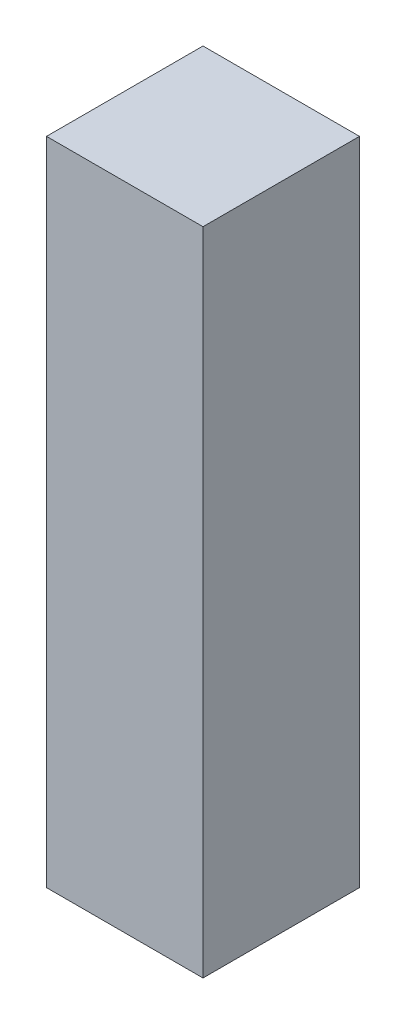
ISO-10303-21;
HEADER;
FILE_DESCRIPTION(('STEP AP214'),'2;1');
FILE_NAME('part.step','',(''),(''),'','','');
FILE_SCHEMA(('AUTOMOTIVE_DESIGN { 1 0 10303 214 1 1 1 1 }'));
ENDSEC;
DATA;
#1=APPLICATION_CONTEXT('core data for automotive mechanical design processes');
#2=APPLICATION_PROTOCOL_DEFINITION('international standard','automotive_design',2000,#1);
#3=PRODUCT_CONTEXT('',#1,'mechanical');
#4=PRODUCT('Part','Part','',(#3));
#5=PRODUCT_RELATED_PRODUCT_CATEGORY('part','',(#4));
#6=PRODUCT_DEFINITION_FORMATION('','',#4);
#7=PRODUCT_DEFINITION_CONTEXT('part definition',#1,'design');
#8=PRODUCT_DEFINITION('design','',#6,#7);
#9=PRODUCT_DEFINITION_SHAPE('','',#8);
#10=(LENGTH_UNIT() NAMED_UNIT(*) SI_UNIT(.MILLI.,.METRE.));
#11=(NAMED_UNIT(*) PLANE_ANGLE_UNIT() SI_UNIT($,.RADIAN.));
#12=(NAMED_UNIT(*) SI_UNIT($,.STERADIAN.) SOLID_ANGLE_UNIT());
#13=UNCERTAINTY_MEASURE_WITH_UNIT(LENGTH_MEASURE(1.E-05),#10,'distance_accuracy_value','');
#14=(GEOMETRIC_REPRESENTATION_CONTEXT(3) GLOBAL_UNCERTAINTY_ASSIGNED_CONTEXT((#13)) GLOBAL_UNIT_ASSIGNED_CONTEXT((#10,
#11,#12)) REPRESENTATION_CONTEXT('',''));
#15=CARTESIAN_POINT('',(0.,0.,0.));
#16=DIRECTION('',(0.,0.,1.));
#17=DIRECTION('',(1.,0.,0.));
#18=AXIS2_PLACEMENT_3D('',#15,#16,#17);
#19=CARTESIAN_POINT('',(0.,158.,0.));
#20=DIRECTION('',(1.,0.,0.));
#21=DIRECTION('',(0.,0.,-1.));
#22=AXIS2_PLACEMENT_3D('',#19,#20,#21);
#23=PLANE('',#22);
#24=DIRECTION('',(0.,0.,1.));
#25=VECTOR('',#24,1.);
#26=CARTESIAN_POINT('',(0.,0.,0.));
#27=LINE('',#26,#25);
#28=CARTESIAN_POINT('',(0.,0.,-38.));
#29=VERTEX_POINT('',#28);
#30=CARTESIAN_POINT('',(0.,0.,0.));
#31=VERTEX_POINT('',#30);
#32=EDGE_CURVE('E101',#29,#31,#27,.T.);
#33=ORIENTED_EDGE('',*,*,#32,.T.);
#34=DIRECTION('',(0.,-1.,0.));
#35=VECTOR('',#34,1.);
#36=CARTESIAN_POINT('',(0.,158.,0.));
#37=LINE('',#36,#35);
#38=CARTESIAN_POINT('',(0.,158.,0.));
#39=VERTEX_POINT('',#38);
#40=EDGE_CURVE('E11',#39,#31,#37,.T.);
#41=ORIENTED_EDGE('',*,*,#40,.F.);
#42=DIRECTION('',(0.,0.,1.));
#43=VECTOR('',#42,1.);
#44=CARTESIAN_POINT('',(0.,158.,0.));
#45=LINE('',#44,#43);
#46=CARTESIAN_POINT('',(0.,158.,-38.));
#47=VERTEX_POINT('',#46);
#48=EDGE_CURVE('E95',#47,#39,#45,.T.);
#49=ORIENTED_EDGE('',*,*,#48,.F.);
#50=DIRECTION('',(0.,-1.,0.));
#51=VECTOR('',#50,1.);
#52=CARTESIAN_POINT('',(0.,158.,-38.));
#53=LINE('',#52,#51);
#54=EDGE_CURVE('E99',#47,#29,#53,.T.);
#55=ORIENTED_EDGE('',*,*,#54,.T.);
#56=EDGE_LOOP('',(#33,#41,#49,#55));
#57=FACE_BOUND('',#56,.T.);
#58=ADVANCED_FACE('F41',(#57),#23,.F.);
#59=CARTESIAN_POINT('',(0.,158.,0.));
#60=DIRECTION('',(0.,0.,-1.));
#61=DIRECTION('',(-1.,0.,0.));
#62=AXIS2_PLACEMENT_3D('',#59,#60,#61);
#63=PLANE('',#62);
#64=DIRECTION('',(1.,0.,0.));
#65=VECTOR('',#64,1.);
#66=CARTESIAN_POINT('',(0.,0.,0.));
#67=LINE('',#66,#65);
#68=CARTESIAN_POINT('',(38.,0.,0.));
#69=VERTEX_POINT('',#68);
#70=EDGE_CURVE('E96',#31,#69,#67,.T.);
#71=ORIENTED_EDGE('',*,*,#70,.T.);
#72=DIRECTION('',(0.,-1.,0.));
#73=VECTOR('',#72,1.);
#74=CARTESIAN_POINT('',(38.,158.,0.));
#75=LINE('',#74,#73);
#76=CARTESIAN_POINT('',(38.,158.,0.));
#77=VERTEX_POINT('',#76);
#78=EDGE_CURVE('E47',#77,#69,#75,.T.);
#79=ORIENTED_EDGE('',*,*,#78,.F.);
#80=DIRECTION('',(1.,0.,0.));
#81=VECTOR('',#80,1.);
#82=CARTESIAN_POINT('',(0.,158.,0.));
#83=LINE('',#82,#81);
#84=EDGE_CURVE('E90',#39,#77,#83,.T.);
#85=ORIENTED_EDGE('',*,*,#84,.F.);
#86=ORIENTED_EDGE('',*,*,#40,.T.);
#87=EDGE_LOOP('',(#71,#79,#85,#86));
#88=FACE_BOUND('',#87,.T.);
#89=ADVANCED_FACE('F94',(#88),#63,.F.);
#90=CARTESIAN_POINT('',(38.,158.,0.));
#91=DIRECTION('',(-1.,0.,0.));
#92=DIRECTION('',(0.,0.,1.));
#93=AXIS2_PLACEMENT_3D('',#90,#91,#92);
#94=PLANE('',#93);
#95=DIRECTION('',(0.,0.,-1.));
#96=VECTOR('',#95,1.);
#97=CARTESIAN_POINT('',(38.,0.,0.));
#98=LINE('',#97,#96);
#99=CARTESIAN_POINT('',(38.,0.,-38.));
#100=VERTEX_POINT('',#99);
#101=EDGE_CURVE('E75',#69,#100,#98,.T.);
#102=ORIENTED_EDGE('',*,*,#101,.T.);
#103=DIRECTION('',(0.,-1.,0.));
#104=VECTOR('',#103,1.);
#105=CARTESIAN_POINT('',(38.,158.,-38.));
#106=LINE('',#105,#104);
#107=CARTESIAN_POINT('',(38.,158.,-38.));
#108=VERTEX_POINT('',#107);
#109=EDGE_CURVE('E100',#108,#100,#106,.T.);
#110=ORIENTED_EDGE('',*,*,#109,.F.);
#111=DIRECTION('',(0.,0.,-1.));
#112=VECTOR('',#111,1.);
#113=CARTESIAN_POINT('',(38.,158.,0.));
#114=LINE('',#113,#112);
#115=EDGE_CURVE('E89',#77,#108,#114,.T.);
#116=ORIENTED_EDGE('',*,*,#115,.F.);
#117=ORIENTED_EDGE('',*,*,#78,.T.);
#118=EDGE_LOOP('',(#102,#110,#116,#117));
#119=FACE_BOUND('',#118,.T.);
#120=ADVANCED_FACE('F97',(#119),#94,.F.);
#121=CARTESIAN_POINT('',(0.,158.,-38.));
#122=DIRECTION('',(0.,0.,1.));
#123=DIRECTION('',(1.,0.,0.));
#124=AXIS2_PLACEMENT_3D('',#121,#122,#123);
#125=PLANE('',#124);
#126=DIRECTION('',(-1.,0.,0.));
#127=VECTOR('',#126,1.);
#128=CARTESIAN_POINT('',(0.,0.,-38.));
#129=LINE('',#128,#127);
#130=EDGE_CURVE('E79',#100,#29,#129,.T.);
#131=ORIENTED_EDGE('',*,*,#130,.T.);
#132=ORIENTED_EDGE('',*,*,#54,.F.);
#133=DIRECTION('',(-1.,0.,0.));
#134=VECTOR('',#133,1.);
#135=CARTESIAN_POINT('',(0.,158.,-38.));
#136=LINE('',#135,#134);
#137=EDGE_CURVE('E60',#108,#47,#136,.T.);
#138=ORIENTED_EDGE('',*,*,#137,.F.);
#139=ORIENTED_EDGE('',*,*,#109,.T.);
#140=EDGE_LOOP('',(#131,#132,#138,#139));
#141=FACE_BOUND('',#140,.T.);
#142=ADVANCED_FACE('F112',(#141),#125,.F.);
#143=CARTESIAN_POINT('',(0.,158.,0.));
#144=DIRECTION('',(0.,-1.,0.));
#145=DIRECTION('',(0.,0.,-1.));
#146=AXIS2_PLACEMENT_3D('',#143,#144,#145);
#147=PLANE('',#146);
#148=ORIENTED_EDGE('',*,*,#48,.T.);
#149=ORIENTED_EDGE('',*,*,#84,.T.);
#150=ORIENTED_EDGE('',*,*,#115,.T.);
#151=ORIENTED_EDGE('',*,*,#137,.T.);
#152=EDGE_LOOP('',(#148,#149,#150,#151));
#153=FACE_BOUND('',#152,.T.);
#154=ADVANCED_FACE('F88',(#153),#147,.F.);
#155=CARTESIAN_POINT('',(0.,0.,0.));
#156=DIRECTION('',(0.,-1.,0.));
#157=DIRECTION('',(0.,0.,-1.));
#158=AXIS2_PLACEMENT_3D('',#155,#156,#157);
#159=PLANE('',#158);
#160=ORIENTED_EDGE('',*,*,#32,.F.);
#161=ORIENTED_EDGE('',*,*,#130,.F.);
#162=ORIENTED_EDGE('',*,*,#101,.F.);
#163=ORIENTED_EDGE('',*,*,#70,.F.);
#164=EDGE_LOOP('',(#160,#161,#162,#163));
#165=FACE_BOUND('',#164,.T.);
#166=ADVANCED_FACE('F114',(#165),#159,.T.);
#167=CLOSED_SHELL('',(#58,#89,#120,#142,#154,#166));
#168=MANIFOLD_SOLID_BREP('B2',#167);
#169=ADVANCED_BREP_SHAPE_REPRESENTATION('',(#18,#168),#14);
#170=SHAPE_DEFINITION_REPRESENTATION(#9,#169);
ENDSEC;
END-ISO-10303-21;
